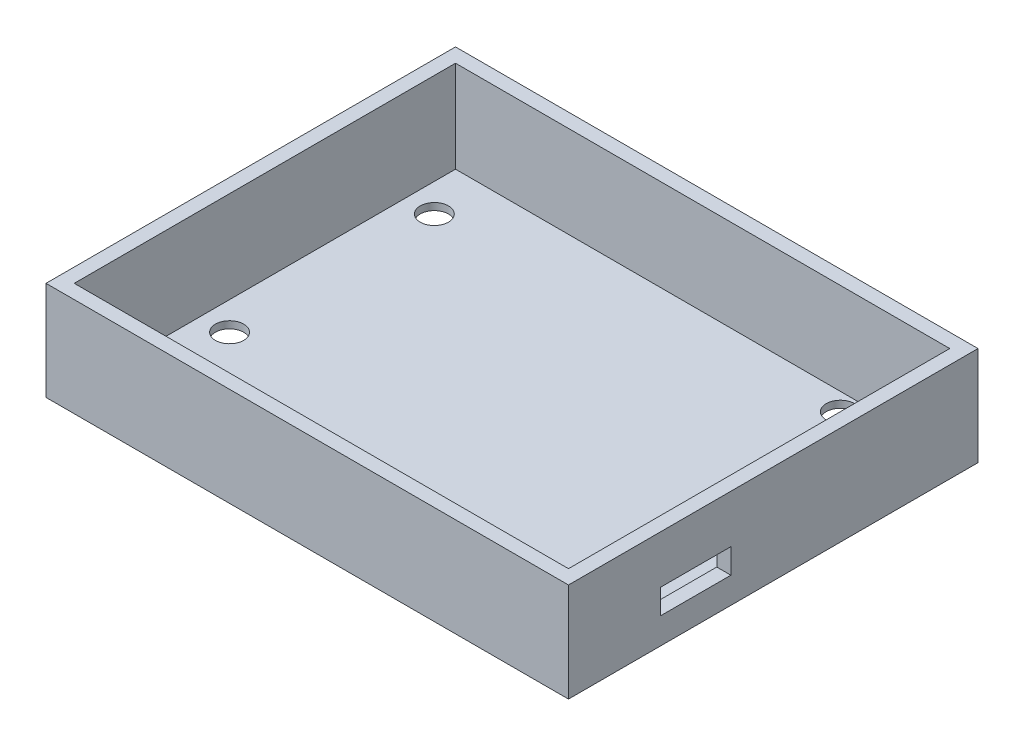
ISO-10303-21;
HEADER;
FILE_DESCRIPTION(('STEP AP214'),'2;1');
FILE_NAME('part.step','',(''),(''),'','','');
FILE_SCHEMA(('AUTOMOTIVE_DESIGN { 1 0 10303 214 1 1 1 1 }'));
ENDSEC;
DATA;
#1=APPLICATION_CONTEXT('core data for automotive mechanical design processes');
#2=APPLICATION_PROTOCOL_DEFINITION('international standard','automotive_design',2000,#1);
#3=PRODUCT_CONTEXT('',#1,'mechanical');
#4=PRODUCT('Part','Part','',(#3));
#5=PRODUCT_RELATED_PRODUCT_CATEGORY('part','',(#4));
#6=PRODUCT_DEFINITION_FORMATION('','',#4);
#7=PRODUCT_DEFINITION_CONTEXT('part definition',#1,'design');
#8=PRODUCT_DEFINITION('design','',#6,#7);
#9=PRODUCT_DEFINITION_SHAPE('','',#8);
#10=(LENGTH_UNIT() NAMED_UNIT(*) SI_UNIT(.MILLI.,.METRE.));
#11=(NAMED_UNIT(*) PLANE_ANGLE_UNIT() SI_UNIT($,.RADIAN.));
#12=(NAMED_UNIT(*) SI_UNIT($,.STERADIAN.) SOLID_ANGLE_UNIT());
#13=UNCERTAINTY_MEASURE_WITH_UNIT(LENGTH_MEASURE(1.E-05),#10,'distance_accuracy_value','');
#14=(GEOMETRIC_REPRESENTATION_CONTEXT(3) GLOBAL_UNCERTAINTY_ASSIGNED_CONTEXT((#13)) GLOBAL_UNIT_ASSIGNED_CONTEXT((#10,
#11,#12)) REPRESENTATION_CONTEXT('',''));
#15=CARTESIAN_POINT('',(0.,0.,0.));
#16=DIRECTION('',(0.,0.,1.));
#17=DIRECTION('',(1.,0.,0.));
#18=AXIS2_PLACEMENT_3D('',#15,#16,#17);
#19=CARTESIAN_POINT('',(0.,0.,0.));
#20=DIRECTION('',(0.,1.,0.));
#21=DIRECTION('',(0.,0.,1.));
#22=AXIS2_PLACEMENT_3D('',#19,#20,#21);
#23=PLANE('',#22);
#24=CARTESIAN_POINT('',(19.5,0.,24.));
#25=DIRECTION('',(0.,1.,0.));
#26=DIRECTION('',(0.,0.,1.));
#27=AXIS2_PLACEMENT_3D('',#24,#25,#26);
#28=CIRCLE('',#27,2.);
#29=CARTESIAN_POINT('',(19.5,0.,26.));
#30=VERTEX_POINT('',#29);
#31=EDGE_CURVE('E265',#30,#30,#28,.T.);
#32=ORIENTED_EDGE('',*,*,#31,.T.);
#33=EDGE_LOOP('',(#32));
#34=FACE_BOUND('',#33,.T.);
#35=CARTESIAN_POINT('',(-31.,0.,-20.));
#36=DIRECTION('',(0.,1.,0.));
#37=DIRECTION('',(0.,0.,1.));
#38=AXIS2_PLACEMENT_3D('',#35,#36,#37);
#39=CIRCLE('',#38,2.);
#40=CARTESIAN_POINT('',(-31.,0.,-18.));
#41=VERTEX_POINT('',#40);
#42=EDGE_CURVE('E273',#41,#41,#39,.T.);
#43=ORIENTED_EDGE('',*,*,#42,.T.);
#44=EDGE_LOOP('',(#43));
#45=FACE_BOUND('',#44,.T.);
#46=CARTESIAN_POINT('',(-31.,0.,8.99999999999999));
#47=DIRECTION('',(0.,1.,0.));
#48=DIRECTION('',(0.,0.,1.));
#49=AXIS2_PLACEMENT_3D('',#46,#47,#48);
#50=CIRCLE('',#49,2.);
#51=CARTESIAN_POINT('',(-31.,0.,11.));
#52=VERTEX_POINT('',#51);
#53=EDGE_CURVE('E284',#52,#52,#50,.T.);
#54=ORIENTED_EDGE('',*,*,#53,.T.);
#55=EDGE_LOOP('',(#54));
#56=FACE_BOUND('',#55,.T.);
#57=CARTESIAN_POINT('',(22.,0.,-24.5));
#58=DIRECTION('',(0.,1.,0.));
#59=DIRECTION('',(0.,0.,1.));
#60=AXIS2_PLACEMENT_3D('',#57,#58,#59);
#61=CIRCLE('',#60,2.);
#62=CARTESIAN_POINT('',(22.,0.,-22.5));
#63=VERTEX_POINT('',#62);
#64=EDGE_CURVE('E272',#63,#63,#61,.T.);
#65=ORIENTED_EDGE('',*,*,#64,.T.);
#66=EDGE_LOOP('',(#65));
#67=FACE_BOUND('',#66,.T.);
#68=DIRECTION('',(-1.,0.,0.));
#69=VECTOR('',#68,1.);
#70=CARTESIAN_POINT('',(-37.,0.,-29.));
#71=LINE('',#70,#69);
#72=CARTESIAN_POINT('',(37.,0.,-29.));
#73=VERTEX_POINT('',#72);
#74=CARTESIAN_POINT('',(-37.,0.,-29.));
#75=VERTEX_POINT('',#74);
#76=EDGE_CURVE('E197',#73,#75,#71,.T.);
#77=ORIENTED_EDGE('',*,*,#76,.F.);
#78=DIRECTION('',(0.,0.,-1.));
#79=VECTOR('',#78,1.);
#80=CARTESIAN_POINT('',(37.,0.,29.));
#81=LINE('',#80,#79);
#82=CARTESIAN_POINT('',(37.,0.,29.));
#83=VERTEX_POINT('',#82);
#84=EDGE_CURVE('E210',#83,#73,#81,.T.);
#85=ORIENTED_EDGE('',*,*,#84,.F.);
#86=DIRECTION('',(1.,0.,0.));
#87=VECTOR('',#86,1.);
#88=CARTESIAN_POINT('',(-37.,0.,29.));
#89=LINE('',#88,#87);
#90=CARTESIAN_POINT('',(-37.,0.,29.));
#91=VERTEX_POINT('',#90);
#92=EDGE_CURVE('E217',#91,#83,#89,.T.);
#93=ORIENTED_EDGE('',*,*,#92,.F.);
#94=DIRECTION('',(0.,0.,1.));
#95=VECTOR('',#94,1.);
#96=CARTESIAN_POINT('',(-37.,0.,29.));
#97=LINE('',#96,#95);
#98=EDGE_CURVE('E213',#75,#91,#97,.T.);
#99=ORIENTED_EDGE('',*,*,#98,.F.);
#100=EDGE_LOOP('',(#77,#85,#93,#99));
#101=FACE_BOUND('',#100,.T.);
#102=ADVANCED_FACE('F105',(#34,#45,#56,#67,#101),#23,.F.);
#103=CARTESIAN_POINT('',(0.,14.,0.));
#104=DIRECTION('',(0.,1.,0.));
#105=DIRECTION('',(0.,0.,1.));
#106=AXIS2_PLACEMENT_3D('',#103,#104,#105);
#107=PLANE('',#106);
#108=DIRECTION('',(-1.,0.,0.));
#109=VECTOR('',#108,1.);
#110=CARTESIAN_POINT('',(-36.,14.,-27.));
#111=LINE('',#110,#109);
#112=CARTESIAN_POINT('',(35.,14.,-27.));
#113=VERTEX_POINT('',#112);
#114=CARTESIAN_POINT('',(-35.,14.,-27.));
#115=VERTEX_POINT('',#114);
#116=EDGE_CURVE('E297',#113,#115,#111,.T.);
#117=ORIENTED_EDGE('',*,*,#116,.F.);
#118=DIRECTION('',(0.,0.,-1.));
#119=VECTOR('',#118,1.);
#120=CARTESIAN_POINT('',(35.,14.,-28.));
#121=LINE('',#120,#119);
#122=CARTESIAN_POINT('',(35.,14.,27.));
#123=VERTEX_POINT('',#122);
#124=EDGE_CURVE('E294',#123,#113,#121,.T.);
#125=ORIENTED_EDGE('',*,*,#124,.F.);
#126=DIRECTION('',(1.,0.,0.));
#127=VECTOR('',#126,1.);
#128=CARTESIAN_POINT('',(-36.,14.,27.));
#129=LINE('',#128,#127);
#130=CARTESIAN_POINT('',(-35.,14.,27.));
#131=VERTEX_POINT('',#130);
#132=EDGE_CURVE('E291',#131,#123,#129,.T.);
#133=ORIENTED_EDGE('',*,*,#132,.F.);
#134=DIRECTION('',(0.,0.,1.));
#135=VECTOR('',#134,1.);
#136=CARTESIAN_POINT('',(-35.,14.,-28.));
#137=LINE('',#136,#135);
#138=EDGE_CURVE('E289',#115,#131,#137,.T.);
#139=ORIENTED_EDGE('',*,*,#138,.F.);
#140=EDGE_LOOP('',(#117,#125,#133,#139));
#141=FACE_BOUND('',#140,.T.);
#142=DIRECTION('',(-1.,0.,0.));
#143=VECTOR('',#142,1.);
#144=CARTESIAN_POINT('',(-37.,14.,-29.));
#145=LINE('',#144,#143);
#146=CARTESIAN_POINT('',(37.,14.,-29.));
#147=VERTEX_POINT('',#146);
#148=CARTESIAN_POINT('',(-37.,14.,-29.));
#149=VERTEX_POINT('',#148);
#150=EDGE_CURVE('E199',#147,#149,#145,.T.);
#151=ORIENTED_EDGE('',*,*,#150,.T.);
#152=DIRECTION('',(0.,0.,1.));
#153=VECTOR('',#152,1.);
#154=CARTESIAN_POINT('',(-37.,14.,-29.));
#155=LINE('',#154,#153);
#156=CARTESIAN_POINT('',(-37.,14.,29.));
#157=VERTEX_POINT('',#156);
#158=EDGE_CURVE('E254',#149,#157,#155,.T.);
#159=ORIENTED_EDGE('',*,*,#158,.T.);
#160=DIRECTION('',(1.,0.,0.));
#161=VECTOR('',#160,1.);
#162=CARTESIAN_POINT('',(-37.,14.,29.));
#163=LINE('',#162,#161);
#164=CARTESIAN_POINT('',(37.,14.,29.));
#165=VERTEX_POINT('',#164);
#166=EDGE_CURVE('E251',#157,#165,#163,.T.);
#167=ORIENTED_EDGE('',*,*,#166,.T.);
#168=DIRECTION('',(0.,0.,-1.));
#169=VECTOR('',#168,1.);
#170=CARTESIAN_POINT('',(37.,14.,-29.));
#171=LINE('',#170,#169);
#172=EDGE_CURVE('E249',#165,#147,#171,.T.);
#173=ORIENTED_EDGE('',*,*,#172,.T.);
#174=EDGE_LOOP('',(#151,#159,#167,#173));
#175=FACE_BOUND('',#174,.T.);
#176=ADVANCED_FACE('F333',(#141,#175),#107,.T.);
#177=CARTESIAN_POINT('',(-35.,14.,-28.));
#178=DIRECTION('',(1.,0.,0.));
#179=DIRECTION('',(0.,0.,-1.));
#180=AXIS2_PLACEMENT_3D('',#177,#178,#179);
#181=PLANE('',#180);
#182=DIRECTION('',(0.,0.,1.));
#183=VECTOR('',#182,1.);
#184=CARTESIAN_POINT('',(-35.,1.,-28.));
#185=LINE('',#184,#183);
#186=CARTESIAN_POINT('',(-35.,1.,-27.));
#187=VERTEX_POINT('',#186);
#188=CARTESIAN_POINT('',(-35.,1.,27.));
#189=VERTEX_POINT('',#188);
#190=EDGE_CURVE('E268',#187,#189,#185,.T.);
#191=ORIENTED_EDGE('',*,*,#190,.F.);
#192=DIRECTION('',(0.,-1.,0.));
#193=VECTOR('',#192,1.);
#194=CARTESIAN_POINT('',(-35.,14.,-27.));
#195=LINE('',#194,#193);
#196=EDGE_CURVE('E299',#115,#187,#195,.T.);
#197=ORIENTED_EDGE('',*,*,#196,.F.);
#198=ORIENTED_EDGE('',*,*,#138,.T.);
#199=DIRECTION('',(0.,-1.,0.));
#200=VECTOR('',#199,1.);
#201=CARTESIAN_POINT('',(-35.,14.,27.));
#202=LINE('',#201,#200);
#203=EDGE_CURVE('E12',#131,#189,#202,.T.);
#204=ORIENTED_EDGE('',*,*,#203,.T.);
#205=EDGE_LOOP('',(#191,#197,#198,#204));
#206=FACE_BOUND('',#205,.T.);
#207=ADVANCED_FACE('F327',(#206),#181,.T.);
#208=CARTESIAN_POINT('',(-36.,14.,27.));
#209=DIRECTION('',(0.,0.,-1.));
#210=DIRECTION('',(-1.,0.,0.));
#211=AXIS2_PLACEMENT_3D('',#208,#209,#210);
#212=PLANE('',#211);
#213=DIRECTION('',(1.,0.,0.));
#214=VECTOR('',#213,1.);
#215=CARTESIAN_POINT('',(-36.,1.,27.));
#216=LINE('',#215,#214);
#217=CARTESIAN_POINT('',(35.,1.,27.));
#218=VERTEX_POINT('',#217);
#219=EDGE_CURVE('E301',#189,#218,#216,.T.);
#220=ORIENTED_EDGE('',*,*,#219,.F.);
#221=ORIENTED_EDGE('',*,*,#203,.F.);
#222=ORIENTED_EDGE('',*,*,#132,.T.);
#223=DIRECTION('',(0.,-1.,0.));
#224=VECTOR('',#223,1.);
#225=CARTESIAN_POINT('',(35.,14.,27.));
#226=LINE('',#225,#224);
#227=EDGE_CURVE('E112',#123,#218,#226,.T.);
#228=ORIENTED_EDGE('',*,*,#227,.T.);
#229=EDGE_LOOP('',(#220,#221,#222,#228));
#230=FACE_BOUND('',#229,.T.);
#231=ADVANCED_FACE('F315',(#230),#212,.T.);
#232=CARTESIAN_POINT('',(35.,14.,-28.));
#233=DIRECTION('',(-1.,0.,0.));
#234=DIRECTION('',(0.,0.,1.));
#235=AXIS2_PLACEMENT_3D('',#232,#233,#234);
#236=PLANE('',#235);
#237=DIRECTION('',(0.,1.,0.));
#238=VECTOR('',#237,1.);
#239=CARTESIAN_POINT('',(35.,5.2,16.));
#240=LINE('',#239,#238);
#241=CARTESIAN_POINT('',(35.,3.7,16.));
#242=VERTEX_POINT('',#241);
#243=CARTESIAN_POINT('',(35.,7.19999999999998,16.));
#244=VERTEX_POINT('',#243);
#245=EDGE_CURVE('E262',#242,#244,#240,.T.);
#246=ORIENTED_EDGE('',*,*,#245,.F.);
#247=DIRECTION('',(0.,0.,-1.));
#248=VECTOR('',#247,1.);
#249=CARTESIAN_POINT('',(35.,3.7,5.99999999999999));
#250=LINE('',#249,#248);
#251=CARTESIAN_POINT('',(35.,3.7,5.99999999999999));
#252=VERTEX_POINT('',#251);
#253=EDGE_CURVE('E234',#242,#252,#250,.T.);
#254=ORIENTED_EDGE('',*,*,#253,.T.);
#255=DIRECTION('',(0.,-1.,0.));
#256=VECTOR('',#255,1.);
#257=CARTESIAN_POINT('',(35.,5.2,5.99999999999999));
#258=LINE('',#257,#256);
#259=CARTESIAN_POINT('',(35.,7.19999999999998,5.99999999999999));
#260=VERTEX_POINT('',#259);
#261=EDGE_CURVE('E127',#260,#252,#258,.T.);
#262=ORIENTED_EDGE('',*,*,#261,.F.);
#263=DIRECTION('',(0.,0.,-1.));
#264=VECTOR('',#263,1.);
#265=CARTESIAN_POINT('',(35.,7.19999999999998,5.99999999999999));
#266=LINE('',#265,#264);
#267=EDGE_CURVE('E239',#244,#260,#266,.T.);
#268=ORIENTED_EDGE('',*,*,#267,.F.);
#269=EDGE_LOOP('',(#246,#254,#262,#268));
#270=FACE_BOUND('',#269,.T.);
#271=DIRECTION('',(0.,0.,-1.));
#272=VECTOR('',#271,1.);
#273=CARTESIAN_POINT('',(35.,1.,-28.));
#274=LINE('',#273,#272);
#275=CARTESIAN_POINT('',(35.,1.,-27.));
#276=VERTEX_POINT('',#275);
#277=EDGE_CURVE('E303',#218,#276,#274,.T.);
#278=ORIENTED_EDGE('',*,*,#277,.F.);
#279=ORIENTED_EDGE('',*,*,#227,.F.);
#280=ORIENTED_EDGE('',*,*,#124,.T.);
#281=DIRECTION('',(0.,-1.,0.));
#282=VECTOR('',#281,1.);
#283=CARTESIAN_POINT('',(35.,14.,-27.));
#284=LINE('',#283,#282);
#285=EDGE_CURVE('E308',#113,#276,#284,.T.);
#286=ORIENTED_EDGE('',*,*,#285,.T.);
#287=EDGE_LOOP('',(#278,#279,#280,#286));
#288=FACE_BOUND('',#287,.T.);
#289=ADVANCED_FACE('F320',(#270,#288),#236,.T.);
#290=CARTESIAN_POINT('',(-36.,14.,-27.));
#291=DIRECTION('',(0.,0.,1.));
#292=DIRECTION('',(1.,0.,0.));
#293=AXIS2_PLACEMENT_3D('',#290,#291,#292);
#294=PLANE('',#293);
#295=DIRECTION('',(-1.,0.,0.));
#296=VECTOR('',#295,1.);
#297=CARTESIAN_POINT('',(-36.,1.,-27.));
#298=LINE('',#297,#296);
#299=EDGE_CURVE('E292',#276,#187,#298,.T.);
#300=ORIENTED_EDGE('',*,*,#299,.F.);
#301=ORIENTED_EDGE('',*,*,#285,.F.);
#302=ORIENTED_EDGE('',*,*,#116,.T.);
#303=ORIENTED_EDGE('',*,*,#196,.T.);
#304=EDGE_LOOP('',(#300,#301,#302,#303));
#305=FACE_BOUND('',#304,.T.);
#306=ADVANCED_FACE('F330',(#305),#294,.T.);
#307=CARTESIAN_POINT('',(0.,1.,0.));
#308=DIRECTION('',(0.,1.,0.));
#309=DIRECTION('',(0.,0.,1.));
#310=AXIS2_PLACEMENT_3D('',#307,#308,#309);
#311=PLANE('',#310);
#312=CARTESIAN_POINT('',(19.5,1.,24.));
#313=DIRECTION('',(0.,1.,0.));
#314=DIRECTION('',(0.,0.,1.));
#315=AXIS2_PLACEMENT_3D('',#312,#313,#314);
#316=CIRCLE('',#315,2.);
#317=CARTESIAN_POINT('',(19.5,1.,26.));
#318=VERTEX_POINT('',#317);
#319=EDGE_CURVE('E269',#318,#318,#316,.T.);
#320=ORIENTED_EDGE('',*,*,#319,.F.);
#321=EDGE_LOOP('',(#320));
#322=FACE_BOUND('',#321,.T.);
#323=CARTESIAN_POINT('',(-31.,1.,-20.));
#324=DIRECTION('',(0.,1.,0.));
#325=DIRECTION('',(0.,0.,1.));
#326=AXIS2_PLACEMENT_3D('',#323,#324,#325);
#327=CIRCLE('',#326,2.);
#328=CARTESIAN_POINT('',(-31.,1.,-18.));
#329=VERTEX_POINT('',#328);
#330=EDGE_CURVE('E264',#329,#329,#327,.T.);
#331=ORIENTED_EDGE('',*,*,#330,.F.);
#332=EDGE_LOOP('',(#331));
#333=FACE_BOUND('',#332,.T.);
#334=CARTESIAN_POINT('',(-31.,1.,8.99999999999999));
#335=DIRECTION('',(0.,1.,0.));
#336=DIRECTION('',(0.,0.,1.));
#337=AXIS2_PLACEMENT_3D('',#334,#335,#336);
#338=CIRCLE('',#337,2.);
#339=CARTESIAN_POINT('',(-31.,1.,11.));
#340=VERTEX_POINT('',#339);
#341=EDGE_CURVE('E276',#340,#340,#338,.T.);
#342=ORIENTED_EDGE('',*,*,#341,.F.);
#343=EDGE_LOOP('',(#342));
#344=FACE_BOUND('',#343,.T.);
#345=CARTESIAN_POINT('',(22.,1.,-24.5));
#346=DIRECTION('',(0.,1.,0.));
#347=DIRECTION('',(0.,0.,1.));
#348=AXIS2_PLACEMENT_3D('',#345,#346,#347);
#349=CIRCLE('',#348,2.);
#350=CARTESIAN_POINT('',(22.,1.,-22.5));
#351=VERTEX_POINT('',#350);
#352=EDGE_CURVE('E281',#351,#351,#349,.T.);
#353=ORIENTED_EDGE('',*,*,#352,.F.);
#354=EDGE_LOOP('',(#353));
#355=FACE_BOUND('',#354,.T.);
#356=ORIENTED_EDGE('',*,*,#190,.T.);
#357=ORIENTED_EDGE('',*,*,#219,.T.);
#358=ORIENTED_EDGE('',*,*,#277,.T.);
#359=ORIENTED_EDGE('',*,*,#299,.T.);
#360=EDGE_LOOP('',(#356,#357,#358,#359));
#361=FACE_BOUND('',#360,.T.);
#362=ADVANCED_FACE('F323',(#322,#333,#344,#355,#361),#311,.T.);
#363=CARTESIAN_POINT('',(22.,0.,-24.5));
#364=DIRECTION('',(0.,1.,0.));
#365=DIRECTION('',(0.,0.,1.));
#366=AXIS2_PLACEMENT_3D('',#363,#364,#365);
#367=CYLINDRICAL_SURFACE('',#366,2.);
#368=ORIENTED_EDGE('',*,*,#64,.F.);
#369=EDGE_LOOP('',(#368));
#370=FACE_BOUND('',#369,.T.);
#371=ORIENTED_EDGE('',*,*,#352,.T.);
#372=EDGE_LOOP('',(#371));
#373=FACE_BOUND('',#372,.T.);
#374=ADVANCED_FACE('F367',(#370,#373),#367,.F.);
#375=CARTESIAN_POINT('',(-31.,0.,8.99999999999999));
#376=DIRECTION('',(0.,1.,0.));
#377=DIRECTION('',(0.,0.,1.));
#378=AXIS2_PLACEMENT_3D('',#375,#376,#377);
#379=CYLINDRICAL_SURFACE('',#378,2.);
#380=ORIENTED_EDGE('',*,*,#53,.F.);
#381=EDGE_LOOP('',(#380));
#382=FACE_BOUND('',#381,.T.);
#383=ORIENTED_EDGE('',*,*,#341,.T.);
#384=EDGE_LOOP('',(#383));
#385=FACE_BOUND('',#384,.T.);
#386=ADVANCED_FACE('F370',(#382,#385),#379,.F.);
#387=CARTESIAN_POINT('',(-31.,0.,-20.));
#388=DIRECTION('',(0.,1.,0.));
#389=DIRECTION('',(0.,0.,1.));
#390=AXIS2_PLACEMENT_3D('',#387,#388,#389);
#391=CYLINDRICAL_SURFACE('',#390,2.);
#392=ORIENTED_EDGE('',*,*,#42,.F.);
#393=EDGE_LOOP('',(#392));
#394=FACE_BOUND('',#393,.T.);
#395=ORIENTED_EDGE('',*,*,#330,.T.);
#396=EDGE_LOOP('',(#395));
#397=FACE_BOUND('',#396,.T.);
#398=ADVANCED_FACE('F391',(#394,#397),#391,.F.);
#399=CARTESIAN_POINT('',(19.5,0.,24.));
#400=DIRECTION('',(0.,1.,0.));
#401=DIRECTION('',(0.,0.,1.));
#402=AXIS2_PLACEMENT_3D('',#399,#400,#401);
#403=CYLINDRICAL_SURFACE('',#402,2.);
#404=ORIENTED_EDGE('',*,*,#31,.F.);
#405=EDGE_LOOP('',(#404));
#406=FACE_BOUND('',#405,.T.);
#407=ORIENTED_EDGE('',*,*,#319,.T.);
#408=EDGE_LOOP('',(#407));
#409=FACE_BOUND('',#408,.T.);
#410=ADVANCED_FACE('F396',(#406,#409),#403,.F.);
#411=CARTESIAN_POINT('',(36.,5.2,5.99999999999999));
#412=DIRECTION('',(0.,0.,-1.));
#413=DIRECTION('',(-1.,0.,0.));
#414=AXIS2_PLACEMENT_3D('',#411,#412,#413);
#415=PLANE('',#414);
#416=ORIENTED_EDGE('',*,*,#261,.T.);
#417=DIRECTION('',(-1.,0.,0.));
#418=VECTOR('',#417,1.);
#419=CARTESIAN_POINT('',(47.1118742080783,3.7,5.99999999999999));
#420=LINE('',#419,#418);
#421=CARTESIAN_POINT('',(37.,3.7,5.99999999999999));
#422=VERTEX_POINT('',#421);
#423=EDGE_CURVE('E237',#422,#252,#420,.T.);
#424=ORIENTED_EDGE('',*,*,#423,.F.);
#425=DIRECTION('',(0.,-1.,0.));
#426=VECTOR('',#425,1.);
#427=CARTESIAN_POINT('',(37.,7.19999999999998,5.99999999999999));
#428=LINE('',#427,#426);
#429=CARTESIAN_POINT('',(37.,7.19999999999998,5.99999999999999));
#430=VERTEX_POINT('',#429);
#431=EDGE_CURVE('E219',#430,#422,#428,.T.);
#432=ORIENTED_EDGE('',*,*,#431,.F.);
#433=DIRECTION('',(-1.,0.,0.));
#434=VECTOR('',#433,1.);
#435=CARTESIAN_POINT('',(36.,7.19999999999998,5.99999999999999));
#436=LINE('',#435,#434);
#437=EDGE_CURVE('E244',#430,#260,#436,.T.);
#438=ORIENTED_EDGE('',*,*,#437,.T.);
#439=EDGE_LOOP('',(#416,#424,#432,#438));
#440=FACE_BOUND('',#439,.T.);
#441=ADVANCED_FACE('F400',(#440),#415,.F.);
#442=CARTESIAN_POINT('',(36.,5.2,16.));
#443=DIRECTION('',(0.,0.,1.));
#444=DIRECTION('',(0.,-1.,0.));
#445=AXIS2_PLACEMENT_3D('',#442,#443,#444);
#446=PLANE('',#445);
#447=DIRECTION('',(-1.,0.,0.));
#448=VECTOR('',#447,1.);
#449=CARTESIAN_POINT('',(36.,7.19999999999998,16.));
#450=LINE('',#449,#448);
#451=CARTESIAN_POINT('',(37.,7.19999999999998,16.));
#452=VERTEX_POINT('',#451);
#453=EDGE_CURVE('E243',#452,#244,#450,.T.);
#454=ORIENTED_EDGE('',*,*,#453,.F.);
#455=DIRECTION('',(0.,1.,0.));
#456=VECTOR('',#455,1.);
#457=CARTESIAN_POINT('',(37.,7.19999999999998,16.));
#458=LINE('',#457,#456);
#459=CARTESIAN_POINT('',(37.,3.69999999999999,16.));
#460=VERTEX_POINT('',#459);
#461=EDGE_CURVE('E228',#460,#452,#458,.T.);
#462=ORIENTED_EDGE('',*,*,#461,.F.);
#463=DIRECTION('',(-1.,0.,0.));
#464=VECTOR('',#463,1.);
#465=CARTESIAN_POINT('',(47.1118742080783,3.7,16.));
#466=LINE('',#465,#464);
#467=EDGE_CURVE('E119',#460,#242,#466,.T.);
#468=ORIENTED_EDGE('',*,*,#467,.T.);
#469=ORIENTED_EDGE('',*,*,#245,.T.);
#470=EDGE_LOOP('',(#454,#462,#468,#469));
#471=FACE_BOUND('',#470,.T.);
#472=ADVANCED_FACE('F403',(#471),#446,.F.);
#473=CARTESIAN_POINT('',(-37.,108.021274188345,-29.));
#474=DIRECTION('',(0.,0.,1.));
#475=DIRECTION('',(1.,0.,0.));
#476=AXIS2_PLACEMENT_3D('',#473,#474,#475);
#477=PLANE('',#476);
#478=ORIENTED_EDGE('',*,*,#150,.F.);
#479=DIRECTION('',(0.,-1.,0.));
#480=VECTOR('',#479,1.);
#481=CARTESIAN_POINT('',(37.,108.021274188345,-29.));
#482=LINE('',#481,#480);
#483=EDGE_CURVE('E194',#147,#73,#482,.T.);
#484=ORIENTED_EDGE('',*,*,#483,.T.);
#485=ORIENTED_EDGE('',*,*,#76,.T.);
#486=DIRECTION('',(0.,-1.,0.));
#487=VECTOR('',#486,1.);
#488=CARTESIAN_POINT('',(-37.,108.021274188345,-29.));
#489=LINE('',#488,#487);
#490=EDGE_CURVE('E204',#149,#75,#489,.T.);
#491=ORIENTED_EDGE('',*,*,#490,.F.);
#492=EDGE_LOOP('',(#478,#484,#485,#491));
#493=FACE_BOUND('',#492,.T.);
#494=ADVANCED_FACE('F196',(#493),#477,.F.);
#495=CARTESIAN_POINT('',(37.,108.021274188345,-29.));
#496=DIRECTION('',(-1.,0.,0.));
#497=DIRECTION('',(0.,0.,1.));
#498=AXIS2_PLACEMENT_3D('',#495,#496,#497);
#499=PLANE('',#498);
#500=DIRECTION('',(0.,0.,-1.));
#501=VECTOR('',#500,1.);
#502=CARTESIAN_POINT('',(37.,7.19999999999998,5.99999999999999));
#503=LINE('',#502,#501);
#504=EDGE_CURVE('E231',#452,#430,#503,.T.);
#505=ORIENTED_EDGE('',*,*,#504,.T.);
#506=ORIENTED_EDGE('',*,*,#431,.T.);
#507=DIRECTION('',(0.,0.,1.));
#508=VECTOR('',#507,1.);
#509=CARTESIAN_POINT('',(37.,3.7,5.99999999999999));
#510=LINE('',#509,#508);
#511=EDGE_CURVE('E225',#422,#460,#510,.T.);
#512=ORIENTED_EDGE('',*,*,#511,.T.);
#513=ORIENTED_EDGE('',*,*,#461,.T.);
#514=EDGE_LOOP('',(#505,#506,#512,#513));
#515=FACE_BOUND('',#514,.T.);
#516=ORIENTED_EDGE('',*,*,#172,.F.);
#517=DIRECTION('',(0.,-1.,0.));
#518=VECTOR('',#517,1.);
#519=CARTESIAN_POINT('',(37.,108.021274188345,29.));
#520=LINE('',#519,#518);
#521=EDGE_CURVE('E203',#165,#83,#520,.T.);
#522=ORIENTED_EDGE('',*,*,#521,.T.);
#523=ORIENTED_EDGE('',*,*,#84,.T.);
#524=ORIENTED_EDGE('',*,*,#483,.F.);
#525=EDGE_LOOP('',(#516,#522,#523,#524));
#526=FACE_BOUND('',#525,.T.);
#527=ADVANCED_FACE('F215',(#515,#526),#499,.F.);
#528=CARTESIAN_POINT('',(-37.,108.021274188345,29.));
#529=DIRECTION('',(0.,0.,-1.));
#530=DIRECTION('',(-1.,0.,0.));
#531=AXIS2_PLACEMENT_3D('',#528,#529,#530);
#532=PLANE('',#531);
#533=ORIENTED_EDGE('',*,*,#166,.F.);
#534=DIRECTION('',(0.,-1.,0.));
#535=VECTOR('',#534,1.);
#536=CARTESIAN_POINT('',(-37.,108.021274188345,29.));
#537=LINE('',#536,#535);
#538=EDGE_CURVE('E259',#157,#91,#537,.T.);
#539=ORIENTED_EDGE('',*,*,#538,.T.);
#540=ORIENTED_EDGE('',*,*,#92,.T.);
#541=ORIENTED_EDGE('',*,*,#521,.F.);
#542=EDGE_LOOP('',(#533,#539,#540,#541));
#543=FACE_BOUND('',#542,.T.);
#544=ADVANCED_FACE('F339',(#543),#532,.F.);
#545=CARTESIAN_POINT('',(-37.,108.021274188345,-29.));
#546=DIRECTION('',(1.,0.,0.));
#547=DIRECTION('',(0.,0.,-1.));
#548=AXIS2_PLACEMENT_3D('',#545,#546,#547);
#549=PLANE('',#548);
#550=ORIENTED_EDGE('',*,*,#158,.F.);
#551=ORIENTED_EDGE('',*,*,#490,.T.);
#552=ORIENTED_EDGE('',*,*,#98,.T.);
#553=ORIENTED_EDGE('',*,*,#538,.F.);
#554=EDGE_LOOP('',(#550,#551,#552,#553));
#555=FACE_BOUND('',#554,.T.);
#556=ADVANCED_FACE('F342',(#555),#549,.F.);
#557=CARTESIAN_POINT('',(36.,7.19999999999998,5.99999999999999));
#558=DIRECTION('',(0.,1.,0.));
#559=DIRECTION('',(0.,0.,1.));
#560=AXIS2_PLACEMENT_3D('',#557,#558,#559);
#561=PLANE('',#560);
#562=ORIENTED_EDGE('',*,*,#267,.T.);
#563=ORIENTED_EDGE('',*,*,#437,.F.);
#564=ORIENTED_EDGE('',*,*,#504,.F.);
#565=ORIENTED_EDGE('',*,*,#453,.T.);
#566=EDGE_LOOP('',(#562,#563,#564,#565));
#567=FACE_BOUND('',#566,.T.);
#568=ADVANCED_FACE('F344',(#567),#561,.F.);
#569=CARTESIAN_POINT('',(47.1118742080783,3.7,5.99999999999999));
#570=DIRECTION('',(0.,1.,0.));
#571=DIRECTION('',(0.,0.,1.));
#572=AXIS2_PLACEMENT_3D('',#569,#570,#571);
#573=PLANE('',#572);
#574=ORIENTED_EDGE('',*,*,#467,.F.);
#575=ORIENTED_EDGE('',*,*,#511,.F.);
#576=ORIENTED_EDGE('',*,*,#423,.T.);
#577=ORIENTED_EDGE('',*,*,#253,.F.);
#578=EDGE_LOOP('',(#574,#575,#576,#577));
#579=FACE_BOUND('',#578,.T.);
#580=ADVANCED_FACE('F350',(#579),#573,.T.);
#581=CLOSED_SHELL('',(#102,#176,#207,#231,#289,#306,#362,#374,#386,#398,#410,#441,#472,#494,
#527,#544,#556,#568,#580));
#582=MANIFOLD_SOLID_BREP('B2',#581);
#583=ADVANCED_BREP_SHAPE_REPRESENTATION('',(#18,#582),#14);
#584=SHAPE_DEFINITION_REPRESENTATION(#9,#583);
ENDSEC;
END-ISO-10303-21;
